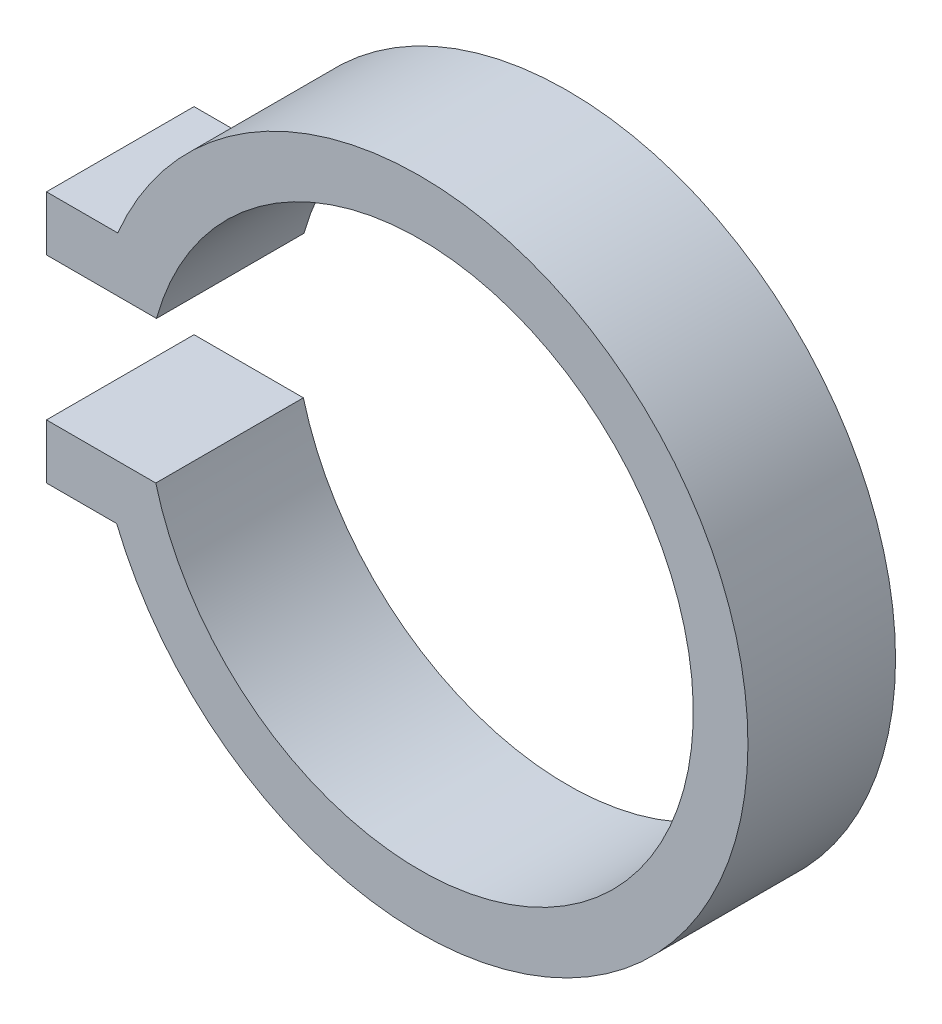
ISO-10303-21;
HEADER;
FILE_DESCRIPTION(('STEP AP214'),'2;1');
FILE_NAME('part.step','',(''),(''),'','','');
FILE_SCHEMA(('AUTOMOTIVE_DESIGN { 1 0 10303 214 1 1 1 1 }'));
ENDSEC;
DATA;
#1=APPLICATION_CONTEXT('core data for automotive mechanical design processes');
#2=APPLICATION_PROTOCOL_DEFINITION('international standard','automotive_design',2000,#1);
#3=PRODUCT_CONTEXT('',#1,'mechanical');
#4=PRODUCT('Part','Part','',(#3));
#5=PRODUCT_RELATED_PRODUCT_CATEGORY('part','',(#4));
#6=PRODUCT_DEFINITION_FORMATION('','',#4);
#7=PRODUCT_DEFINITION_CONTEXT('part definition',#1,'design');
#8=PRODUCT_DEFINITION('design','',#6,#7);
#9=PRODUCT_DEFINITION_SHAPE('','',#8);
#10=(LENGTH_UNIT() NAMED_UNIT(*) SI_UNIT(.MILLI.,.METRE.));
#11=(NAMED_UNIT(*) PLANE_ANGLE_UNIT() SI_UNIT($,.RADIAN.));
#12=(NAMED_UNIT(*) SI_UNIT($,.STERADIAN.) SOLID_ANGLE_UNIT());
#13=UNCERTAINTY_MEASURE_WITH_UNIT(LENGTH_MEASURE(1.E-05),#10,'distance_accuracy_value','');
#14=(GEOMETRIC_REPRESENTATION_CONTEXT(3) GLOBAL_UNCERTAINTY_ASSIGNED_CONTEXT((#13)) GLOBAL_UNIT_ASSIGNED_CONTEXT((#10,
#11,#12)) REPRESENTATION_CONTEXT('',''));
#15=CARTESIAN_POINT('',(0.,0.,0.));
#16=DIRECTION('',(0.,0.,1.));
#17=DIRECTION('',(1.,0.,0.));
#18=AXIS2_PLACEMENT_3D('',#15,#16,#17);
#19=CARTESIAN_POINT('',(0.,0.,27.));
#20=DIRECTION('',(0.,0.,-1.));
#21=DIRECTION('',(-1.,0.,0.));
#22=AXIS2_PLACEMENT_3D('',#19,#20,#21);
#23=CYLINDRICAL_SURFACE('',#22,50.);
#24=CARTESIAN_POINT('',(0.,0.,0.));
#25=DIRECTION('',(0.,0.,1.));
#26=DIRECTION('',(1.,0.,0.));
#27=AXIS2_PLACEMENT_3D('',#24,#25,#26);
#28=CIRCLE('',#27,50.);
#29=CARTESIAN_POINT('',(-48.3262852622495,-12.8284898858628,0.));
#30=VERTEX_POINT('',#29);
#31=CARTESIAN_POINT('',(-48.197524461497,13.3040834251516,0.));
#32=VERTEX_POINT('',#31);
#33=EDGE_CURVE('E146',#30,#32,#28,.T.);
#34=ORIENTED_EDGE('',*,*,#33,.F.);
#35=DIRECTION('',(0.,0.,-1.));
#36=VECTOR('',#35,1.);
#37=CARTESIAN_POINT('',(-48.3262852622495,-12.8284898858628,27.));
#38=LINE('',#37,#36);
#39=CARTESIAN_POINT('',(-48.3262852622495,-12.8284898858628,27.));
#40=VERTEX_POINT('',#39);
#41=EDGE_CURVE('E11',#40,#30,#38,.T.);
#42=ORIENTED_EDGE('',*,*,#41,.F.);
#43=CARTESIAN_POINT('',(0.,0.,27.));
#44=DIRECTION('',(0.,0.,1.));
#45=DIRECTION('',(1.,0.,0.));
#46=AXIS2_PLACEMENT_3D('',#43,#44,#45);
#47=CIRCLE('',#46,50.);
#48=CARTESIAN_POINT('',(-48.197524461497,13.3040834251516,27.));
#49=VERTEX_POINT('',#48);
#50=EDGE_CURVE('E171',#40,#49,#47,.T.);
#51=ORIENTED_EDGE('',*,*,#50,.T.);
#52=DIRECTION('',(0.,0.,-1.));
#53=VECTOR('',#52,1.);
#54=CARTESIAN_POINT('',(-48.197524461497,13.3040834251516,27.));
#55=LINE('',#54,#53);
#56=EDGE_CURVE('E62',#49,#32,#55,.T.);
#57=ORIENTED_EDGE('',*,*,#56,.T.);
#58=EDGE_LOOP('',(#34,#42,#51,#57));
#59=FACE_BOUND('',#58,.T.);
#60=ADVANCED_FACE('F45',(#59),#23,.F.);
#61=CARTESIAN_POINT('',(0.,-12.8284898858628,27.));
#62=DIRECTION('',(0.,-1.,0.));
#63=DIRECTION('',(1.,0.,0.));
#64=AXIS2_PLACEMENT_3D('',#61,#62,#63);
#65=PLANE('',#64);
#66=DIRECTION('',(-1.,0.,0.));
#67=VECTOR('',#66,1.);
#68=CARTESIAN_POINT('',(0.,-12.8284898858628,0.));
#69=LINE('',#68,#67);
#70=CARTESIAN_POINT('',(-68.3262852622495,-12.8284898858628,0.));
#71=VERTEX_POINT('',#70);
#72=EDGE_CURVE('E149',#30,#71,#69,.T.);
#73=ORIENTED_EDGE('',*,*,#72,.T.);
#74=DIRECTION('',(0.,0.,-1.));
#75=VECTOR('',#74,1.);
#76=CARTESIAN_POINT('',(-68.3262852622495,-12.8284898858628,27.));
#77=LINE('',#76,#75);
#78=CARTESIAN_POINT('',(-68.3262852622495,-12.8284898858628,27.));
#79=VERTEX_POINT('',#78);
#80=EDGE_CURVE('E54',#79,#71,#77,.T.);
#81=ORIENTED_EDGE('',*,*,#80,.F.);
#82=DIRECTION('',(-1.,0.,0.));
#83=VECTOR('',#82,1.);
#84=CARTESIAN_POINT('',(0.,-12.8284898858628,27.));
#85=LINE('',#84,#83);
#86=EDGE_CURVE('E306',#40,#79,#85,.T.);
#87=ORIENTED_EDGE('',*,*,#86,.F.);
#88=ORIENTED_EDGE('',*,*,#41,.T.);
#89=EDGE_LOOP('',(#73,#81,#87,#88));
#90=FACE_BOUND('',#89,.T.);
#91=ADVANCED_FACE('F217',(#90),#65,.F.);
#92=CARTESIAN_POINT('',(-68.3262852622495,0.,27.));
#93=DIRECTION('',(1.,0.,0.));
#94=DIRECTION('',(0.,0.,-1.));
#95=AXIS2_PLACEMENT_3D('',#92,#93,#94);
#96=PLANE('',#95);
#97=DIRECTION('',(0.,-1.,0.));
#98=VECTOR('',#97,1.);
#99=CARTESIAN_POINT('',(-68.3262852622495,0.,0.));
#100=LINE('',#99,#98);
#101=CARTESIAN_POINT('',(-68.3262852622495,-22.8284898858628,0.));
#102=VERTEX_POINT('',#101);
#103=EDGE_CURVE('E152',#71,#102,#100,.T.);
#104=ORIENTED_EDGE('',*,*,#103,.T.);
#105=DIRECTION('',(0.,0.,-1.));
#106=VECTOR('',#105,1.);
#107=CARTESIAN_POINT('',(-68.3262852622495,-22.8284898858628,27.));
#108=LINE('',#107,#106);
#109=CARTESIAN_POINT('',(-68.3262852622495,-22.8284898858628,27.));
#110=VERTEX_POINT('',#109);
#111=EDGE_CURVE('E182',#110,#102,#108,.T.);
#112=ORIENTED_EDGE('',*,*,#111,.F.);
#113=DIRECTION('',(0.,-1.,0.));
#114=VECTOR('',#113,1.);
#115=CARTESIAN_POINT('',(-68.3262852622495,0.,27.));
#116=LINE('',#115,#114);
#117=EDGE_CURVE('E193',#79,#110,#116,.T.);
#118=ORIENTED_EDGE('',*,*,#117,.F.);
#119=ORIENTED_EDGE('',*,*,#80,.T.);
#120=EDGE_LOOP('',(#104,#112,#118,#119));
#121=FACE_BOUND('',#120,.T.);
#122=ADVANCED_FACE('F191',(#121),#96,.F.);
#123=CARTESIAN_POINT('',(0.,-22.8284898858628,27.));
#124=DIRECTION('',(0.,1.,0.));
#125=DIRECTION('',(-1.,0.,0.));
#126=AXIS2_PLACEMENT_3D('',#123,#124,#125);
#127=PLANE('',#126);
#128=DIRECTION('',(1.,0.,0.));
#129=VECTOR('',#128,1.);
#130=CARTESIAN_POINT('',(0.,-22.8284898858628,0.));
#131=LINE('',#130,#129);
#132=CARTESIAN_POINT('',(-55.4874765107502,-22.8284898858628,0.));
#133=VERTEX_POINT('',#132);
#134=EDGE_CURVE('E155',#102,#133,#131,.T.);
#135=ORIENTED_EDGE('',*,*,#134,.T.);
#136=DIRECTION('',(0.,0.,-1.));
#137=VECTOR('',#136,1.);
#138=CARTESIAN_POINT('',(-55.4874765107502,-22.8284898858628,27.));
#139=LINE('',#138,#137);
#140=CARTESIAN_POINT('',(-55.4874765107502,-22.8284898858628,27.));
#141=VERTEX_POINT('',#140);
#142=EDGE_CURVE('E178',#141,#133,#139,.T.);
#143=ORIENTED_EDGE('',*,*,#142,.F.);
#144=DIRECTION('',(1.,0.,0.));
#145=VECTOR('',#144,1.);
#146=CARTESIAN_POINT('',(0.,-22.8284898858628,27.));
#147=LINE('',#146,#145);
#148=EDGE_CURVE('E140',#110,#141,#147,.T.);
#149=ORIENTED_EDGE('',*,*,#148,.F.);
#150=ORIENTED_EDGE('',*,*,#111,.T.);
#151=EDGE_LOOP('',(#135,#143,#149,#150));
#152=FACE_BOUND('',#151,.T.);
#153=ADVANCED_FACE('F202',(#152),#127,.F.);
#154=CARTESIAN_POINT('',(0.,0.,27.));
#155=DIRECTION('',(0.,0.,-1.));
#156=DIRECTION('',(-1.,0.,0.));
#157=AXIS2_PLACEMENT_3D('',#154,#155,#156);
#158=CYLINDRICAL_SURFACE('',#157,60.);
#159=CARTESIAN_POINT('',(0.,0.,0.));
#160=DIRECTION('',(0.,0.,1.));
#161=DIRECTION('',(1.,0.,0.));
#162=AXIS2_PLACEMENT_3D('',#159,#160,#161);
#163=CIRCLE('',#162,60.);
#164=CARTESIAN_POINT('',(-55.2894175743747,23.3040834251516,0.));
#165=VERTEX_POINT('',#164);
#166=EDGE_CURVE('E158',#133,#165,#163,.T.);
#167=ORIENTED_EDGE('',*,*,#166,.T.);
#168=DIRECTION('',(0.,0.,-1.));
#169=VECTOR('',#168,1.);
#170=CARTESIAN_POINT('',(-55.2894175743747,23.3040834251516,27.));
#171=LINE('',#170,#169);
#172=CARTESIAN_POINT('',(-55.2894175743747,23.3040834251516,27.));
#173=VERTEX_POINT('',#172);
#174=EDGE_CURVE('E123',#173,#165,#171,.T.);
#175=ORIENTED_EDGE('',*,*,#174,.F.);
#176=CARTESIAN_POINT('',(0.,0.,27.));
#177=DIRECTION('',(0.,0.,1.));
#178=DIRECTION('',(1.,0.,0.));
#179=AXIS2_PLACEMENT_3D('',#176,#177,#178);
#180=CIRCLE('',#179,60.);
#181=EDGE_CURVE('E135',#141,#173,#180,.T.);
#182=ORIENTED_EDGE('',*,*,#181,.F.);
#183=ORIENTED_EDGE('',*,*,#142,.T.);
#184=EDGE_LOOP('',(#167,#175,#182,#183));
#185=FACE_BOUND('',#184,.T.);
#186=ADVANCED_FACE('F205',(#185),#158,.T.);
#187=CARTESIAN_POINT('',(0.,23.3040834251519,27.));
#188=DIRECTION('',(0.,1.,0.));
#189=DIRECTION('',(-1.,0.,0.));
#190=AXIS2_PLACEMENT_3D('',#187,#188,#189);
#191=PLANE('',#190);
#192=DIRECTION('',(1.,0.,0.));
#193=VECTOR('',#192,1.);
#194=CARTESIAN_POINT('',(0.,23.3040834251519,0.));
#195=LINE('',#194,#193);
#196=CARTESIAN_POINT('',(-68.3262852622495,23.3040834251516,0.));
#197=VERTEX_POINT('',#196);
#198=EDGE_CURVE('E119',#197,#165,#195,.T.);
#199=ORIENTED_EDGE('',*,*,#198,.F.);
#200=DIRECTION('',(0.,0.,-1.));
#201=VECTOR('',#200,1.);
#202=CARTESIAN_POINT('',(-68.3262852622495,23.3040834251516,27.));
#203=LINE('',#202,#201);
#204=CARTESIAN_POINT('',(-68.3262852622495,23.3040834251516,27.));
#205=VERTEX_POINT('',#204);
#206=EDGE_CURVE('E113',#205,#197,#203,.T.);
#207=ORIENTED_EDGE('',*,*,#206,.F.);
#208=DIRECTION('',(1.,0.,0.));
#209=VECTOR('',#208,1.);
#210=CARTESIAN_POINT('',(0.,23.3040834251519,27.));
#211=LINE('',#210,#209);
#212=EDGE_CURVE('E117',#205,#173,#211,.T.);
#213=ORIENTED_EDGE('',*,*,#212,.T.);
#214=ORIENTED_EDGE('',*,*,#174,.T.);
#215=EDGE_LOOP('',(#199,#207,#213,#214));
#216=FACE_BOUND('',#215,.T.);
#217=ADVANCED_FACE('F115',(#216),#191,.T.);
#218=CARTESIAN_POINT('',(-68.3262852622495,0.,27.));
#219=DIRECTION('',(1.,0.,0.));
#220=DIRECTION('',(0.,0.,-1.));
#221=AXIS2_PLACEMENT_3D('',#218,#219,#220);
#222=PLANE('',#221);
#223=DIRECTION('',(0.,-1.,0.));
#224=VECTOR('',#223,1.);
#225=CARTESIAN_POINT('',(-68.3262852622495,0.,0.));
#226=LINE('',#225,#224);
#227=CARTESIAN_POINT('',(-68.3262852622495,13.3040834251516,0.));
#228=VERTEX_POINT('',#227);
#229=EDGE_CURVE('E164',#197,#228,#226,.T.);
#230=ORIENTED_EDGE('',*,*,#229,.T.);
#231=DIRECTION('',(0.,0.,-1.));
#232=VECTOR('',#231,1.);
#233=CARTESIAN_POINT('',(-68.3262852622495,13.3040834251516,27.));
#234=LINE('',#233,#232);
#235=CARTESIAN_POINT('',(-68.3262852622495,13.3040834251516,27.));
#236=VERTEX_POINT('',#235);
#237=EDGE_CURVE('E88',#236,#228,#234,.T.);
#238=ORIENTED_EDGE('',*,*,#237,.F.);
#239=DIRECTION('',(0.,-1.,0.));
#240=VECTOR('',#239,1.);
#241=CARTESIAN_POINT('',(-68.3262852622495,0.,27.));
#242=LINE('',#241,#240);
#243=EDGE_CURVE('E125',#205,#236,#242,.T.);
#244=ORIENTED_EDGE('',*,*,#243,.F.);
#245=ORIENTED_EDGE('',*,*,#206,.T.);
#246=EDGE_LOOP('',(#230,#238,#244,#245));
#247=FACE_BOUND('',#246,.T.);
#248=ADVANCED_FACE('F126',(#247),#222,.F.);
#249=CARTESIAN_POINT('',(0.,13.3040834251518,27.));
#250=DIRECTION('',(0.,-1.,0.));
#251=DIRECTION('',(1.,0.,0.));
#252=AXIS2_PLACEMENT_3D('',#249,#250,#251);
#253=PLANE('',#252);
#254=DIRECTION('',(-1.,0.,0.));
#255=VECTOR('',#254,1.);
#256=CARTESIAN_POINT('',(0.,13.3040834251518,0.));
#257=LINE('',#256,#255);
#258=EDGE_CURVE('E167',#32,#228,#257,.T.);
#259=ORIENTED_EDGE('',*,*,#258,.F.);
#260=ORIENTED_EDGE('',*,*,#56,.F.);
#261=DIRECTION('',(-1.,0.,0.));
#262=VECTOR('',#261,1.);
#263=CARTESIAN_POINT('',(0.,13.3040834251518,27.));
#264=LINE('',#263,#262);
#265=EDGE_CURVE('E130',#49,#236,#264,.T.);
#266=ORIENTED_EDGE('',*,*,#265,.T.);
#267=ORIENTED_EDGE('',*,*,#237,.T.);
#268=EDGE_LOOP('',(#259,#260,#266,#267));
#269=FACE_BOUND('',#268,.T.);
#270=ADVANCED_FACE('F206',(#269),#253,.T.);
#271=CARTESIAN_POINT('',(0.,0.,27.));
#272=DIRECTION('',(0.,0.,1.));
#273=DIRECTION('',(1.,0.,0.));
#274=AXIS2_PLACEMENT_3D('',#271,#272,#273);
#275=PLANE('',#274);
#276=ORIENTED_EDGE('',*,*,#50,.F.);
#277=ORIENTED_EDGE('',*,*,#86,.T.);
#278=ORIENTED_EDGE('',*,*,#117,.T.);
#279=ORIENTED_EDGE('',*,*,#148,.T.);
#280=ORIENTED_EDGE('',*,*,#181,.T.);
#281=ORIENTED_EDGE('',*,*,#212,.F.);
#282=ORIENTED_EDGE('',*,*,#243,.T.);
#283=ORIENTED_EDGE('',*,*,#265,.F.);
#284=EDGE_LOOP('',(#276,#277,#278,#279,#280,#281,#282,#283));
#285=FACE_BOUND('',#284,.T.);
#286=ADVANCED_FACE('F133',(#285),#275,.T.);
#287=CARTESIAN_POINT('',(0.,0.,0.));
#288=DIRECTION('',(0.,0.,1.));
#289=DIRECTION('',(1.,0.,0.));
#290=AXIS2_PLACEMENT_3D('',#287,#288,#289);
#291=PLANE('',#290);
#292=ORIENTED_EDGE('',*,*,#33,.T.);
#293=ORIENTED_EDGE('',*,*,#258,.T.);
#294=ORIENTED_EDGE('',*,*,#229,.F.);
#295=ORIENTED_EDGE('',*,*,#198,.T.);
#296=ORIENTED_EDGE('',*,*,#166,.F.);
#297=ORIENTED_EDGE('',*,*,#134,.F.);
#298=ORIENTED_EDGE('',*,*,#103,.F.);
#299=ORIENTED_EDGE('',*,*,#72,.F.);
#300=EDGE_LOOP('',(#292,#293,#294,#295,#296,#297,#298,#299));
#301=FACE_BOUND('',#300,.T.);
#302=ADVANCED_FACE('F198',(#301),#291,.F.);
#303=CLOSED_SHELL('',(#60,#91,#122,#153,#186,#217,#248,#270,#286,#302));
#304=MANIFOLD_SOLID_BREP('B2',#303);
#305=ADVANCED_BREP_SHAPE_REPRESENTATION('',(#18,#304),#14);
#306=SHAPE_DEFINITION_REPRESENTATION(#9,#305);
ENDSEC;
END-ISO-10303-21;
